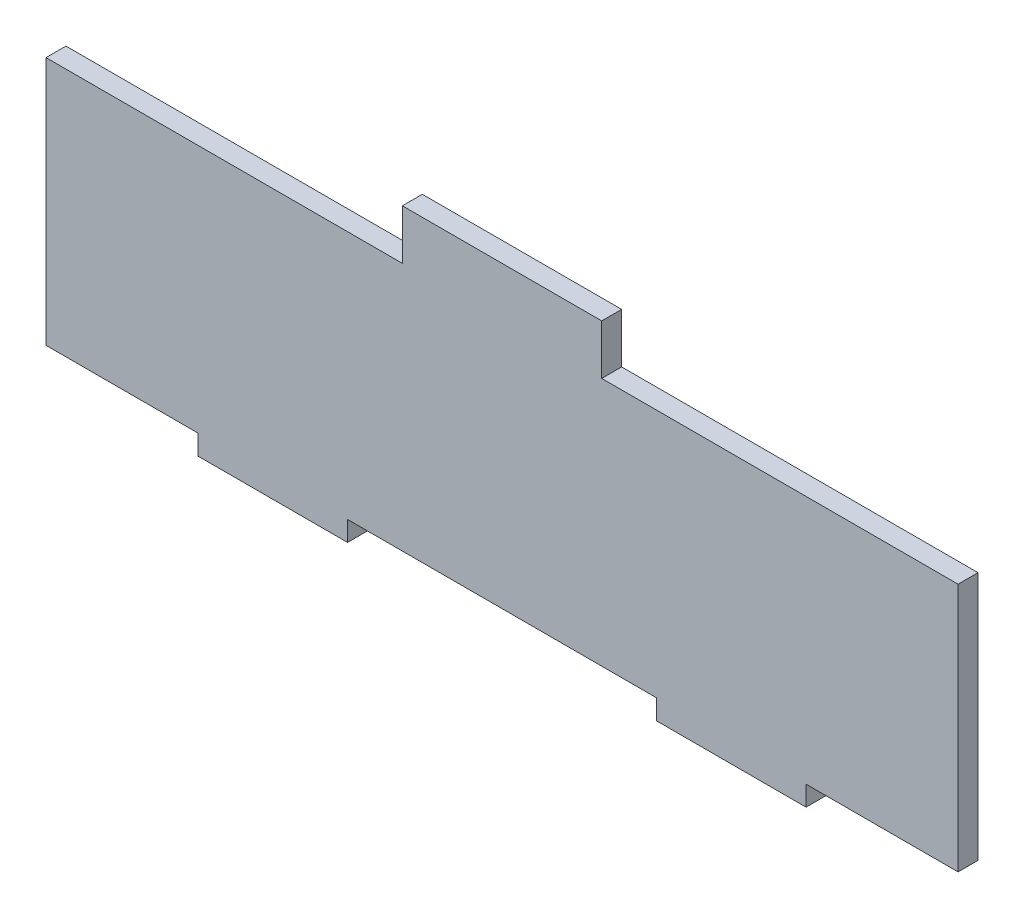
ISO-10303-21;
HEADER;
FILE_DESCRIPTION(('STEP AP214'),'2;1');
FILE_NAME('part.step','',(''),(''),'','','');
FILE_SCHEMA(('AUTOMOTIVE_DESIGN { 1 0 10303 214 1 1 1 1 }'));
ENDSEC;
DATA;
#1=APPLICATION_CONTEXT('core data for automotive mechanical design processes');
#2=APPLICATION_PROTOCOL_DEFINITION('international standard','automotive_design',2000,#1);
#3=PRODUCT_CONTEXT('',#1,'mechanical');
#4=PRODUCT('Part','Part','',(#3));
#5=PRODUCT_RELATED_PRODUCT_CATEGORY('part','',(#4));
#6=PRODUCT_DEFINITION_FORMATION('','',#4);
#7=PRODUCT_DEFINITION_CONTEXT('part definition',#1,'design');
#8=PRODUCT_DEFINITION('design','',#6,#7);
#9=PRODUCT_DEFINITION_SHAPE('','',#8);
#10=(LENGTH_UNIT() NAMED_UNIT(*) SI_UNIT(.MILLI.,.METRE.));
#11=(NAMED_UNIT(*) PLANE_ANGLE_UNIT() SI_UNIT($,.RADIAN.));
#12=(NAMED_UNIT(*) SI_UNIT($,.STERADIAN.) SOLID_ANGLE_UNIT());
#13=UNCERTAINTY_MEASURE_WITH_UNIT(LENGTH_MEASURE(1.E-05),#10,'distance_accuracy_value','');
#14=(GEOMETRIC_REPRESENTATION_CONTEXT(3) GLOBAL_UNCERTAINTY_ASSIGNED_CONTEXT((#13)) GLOBAL_UNIT_ASSIGNED_CONTEXT((#10,
#11,#12)) REPRESENTATION_CONTEXT('',''));
#15=CARTESIAN_POINT('',(0.,0.,0.));
#16=DIRECTION('',(0.,0.,1.));
#17=DIRECTION('',(1.,0.,0.));
#18=AXIS2_PLACEMENT_3D('',#15,#16,#17);
#19=CARTESIAN_POINT('',(20.,25.,4.));
#20=DIRECTION('',(0.,-1.,0.));
#21=DIRECTION('',(0.,0.,-1.));
#22=AXIS2_PLACEMENT_3D('',#19,#20,#21);
#23=PLANE('',#22);
#24=DIRECTION('',(-1.,0.,0.));
#25=VECTOR('',#24,1.);
#26=CARTESIAN_POINT('',(20.,25.,0.));
#27=LINE('',#26,#25);
#28=CARTESIAN_POINT('',(91.5,25.,0.));
#29=VERTEX_POINT('',#28);
#30=CARTESIAN_POINT('',(20.,25.,0.));
#31=VERTEX_POINT('',#30);
#32=EDGE_CURVE('E181',#29,#31,#27,.T.);
#33=ORIENTED_EDGE('',*,*,#32,.T.);
#34=DIRECTION('',(0.,0.,-1.));
#35=VECTOR('',#34,1.);
#36=CARTESIAN_POINT('',(20.,25.,4.));
#37=LINE('',#36,#35);
#38=CARTESIAN_POINT('',(20.,25.,4.));
#39=VERTEX_POINT('',#38);
#40=EDGE_CURVE('E11',#39,#31,#37,.T.);
#41=ORIENTED_EDGE('',*,*,#40,.F.);
#42=DIRECTION('',(-1.,0.,0.));
#43=VECTOR('',#42,1.);
#44=CARTESIAN_POINT('',(20.,25.,4.));
#45=LINE('',#44,#43);
#46=CARTESIAN_POINT('',(91.5,25.,4.));
#47=VERTEX_POINT('',#46);
#48=EDGE_CURVE('E213',#47,#39,#45,.T.);
#49=ORIENTED_EDGE('',*,*,#48,.F.);
#50=DIRECTION('',(0.,0.,-1.));
#51=VECTOR('',#50,1.);
#52=CARTESIAN_POINT('',(91.5,25.,4.));
#53=LINE('',#52,#51);
#54=EDGE_CURVE('E179',#47,#29,#53,.T.);
#55=ORIENTED_EDGE('',*,*,#54,.T.);
#56=EDGE_LOOP('',(#33,#41,#49,#55));
#57=FACE_BOUND('',#56,.T.);
#58=ADVANCED_FACE('F39',(#57),#23,.F.);
#59=CARTESIAN_POINT('',(20.,35.,4.));
#60=DIRECTION('',(-1.,0.,0.));
#61=DIRECTION('',(0.,0.,1.));
#62=AXIS2_PLACEMENT_3D('',#59,#60,#61);
#63=PLANE('',#62);
#64=DIRECTION('',(0.,1.,0.));
#65=VECTOR('',#64,1.);
#66=CARTESIAN_POINT('',(20.,35.,0.));
#67=LINE('',#66,#65);
#68=CARTESIAN_POINT('',(20.,35.,0.));
#69=VERTEX_POINT('',#68);
#70=EDGE_CURVE('E189',#31,#69,#67,.T.);
#71=ORIENTED_EDGE('',*,*,#70,.T.);
#72=DIRECTION('',(0.,0.,-1.));
#73=VECTOR('',#72,1.);
#74=CARTESIAN_POINT('',(20.,35.,4.));
#75=LINE('',#74,#73);
#76=CARTESIAN_POINT('',(20.,35.,4.));
#77=VERTEX_POINT('',#76);
#78=EDGE_CURVE('E50',#77,#69,#75,.T.);
#79=ORIENTED_EDGE('',*,*,#78,.F.);
#80=DIRECTION('',(0.,1.,0.));
#81=VECTOR('',#80,1.);
#82=CARTESIAN_POINT('',(20.,35.,4.));
#83=LINE('',#82,#81);
#84=EDGE_CURVE('E125',#39,#77,#83,.T.);
#85=ORIENTED_EDGE('',*,*,#84,.F.);
#86=ORIENTED_EDGE('',*,*,#40,.T.);
#87=EDGE_LOOP('',(#71,#79,#85,#86));
#88=FACE_BOUND('',#87,.T.);
#89=ADVANCED_FACE('F313',(#88),#63,.F.);
#90=CARTESIAN_POINT('',(-20.,35.,4.));
#91=DIRECTION('',(0.,-1.,0.));
#92=DIRECTION('',(0.,0.,-1.));
#93=AXIS2_PLACEMENT_3D('',#90,#91,#92);
#94=PLANE('',#93);
#95=DIRECTION('',(-1.,0.,0.));
#96=VECTOR('',#95,1.);
#97=CARTESIAN_POINT('',(-20.,35.,0.));
#98=LINE('',#97,#96);
#99=CARTESIAN_POINT('',(-20.,35.,0.));
#100=VERTEX_POINT('',#99);
#101=EDGE_CURVE('E190',#69,#100,#98,.T.);
#102=ORIENTED_EDGE('',*,*,#101,.T.);
#103=DIRECTION('',(0.,0.,-1.));
#104=VECTOR('',#103,1.);
#105=CARTESIAN_POINT('',(-20.,35.,4.));
#106=LINE('',#105,#104);
#107=CARTESIAN_POINT('',(-20.,35.,4.));
#108=VERTEX_POINT('',#107);
#109=EDGE_CURVE('E243',#108,#100,#106,.T.);
#110=ORIENTED_EDGE('',*,*,#109,.F.);
#111=DIRECTION('',(-1.,0.,0.));
#112=VECTOR('',#111,1.);
#113=CARTESIAN_POINT('',(-20.,35.,4.));
#114=LINE('',#113,#112);
#115=EDGE_CURVE('E252',#77,#108,#114,.T.);
#116=ORIENTED_EDGE('',*,*,#115,.F.);
#117=ORIENTED_EDGE('',*,*,#78,.T.);
#118=EDGE_LOOP('',(#102,#110,#116,#117));
#119=FACE_BOUND('',#118,.T.);
#120=ADVANCED_FACE('F247',(#119),#94,.F.);
#121=CARTESIAN_POINT('',(-20.,25.,4.));
#122=DIRECTION('',(1.,0.,0.));
#123=DIRECTION('',(0.,0.,-1.));
#124=AXIS2_PLACEMENT_3D('',#121,#122,#123);
#125=PLANE('',#124);
#126=DIRECTION('',(0.,-1.,0.));
#127=VECTOR('',#126,1.);
#128=CARTESIAN_POINT('',(-20.,25.,0.));
#129=LINE('',#128,#127);
#130=CARTESIAN_POINT('',(-20.,25.,0.));
#131=VERTEX_POINT('',#130);
#132=EDGE_CURVE('E187',#100,#131,#129,.T.);
#133=ORIENTED_EDGE('',*,*,#132,.T.);
#134=DIRECTION('',(0.,0.,-1.));
#135=VECTOR('',#134,1.);
#136=CARTESIAN_POINT('',(-20.,25.,4.));
#137=LINE('',#136,#135);
#138=CARTESIAN_POINT('',(-20.,25.,4.));
#139=VERTEX_POINT('',#138);
#140=EDGE_CURVE('E244',#139,#131,#137,.T.);
#141=ORIENTED_EDGE('',*,*,#140,.F.);
#142=DIRECTION('',(0.,-1.,0.));
#143=VECTOR('',#142,1.);
#144=CARTESIAN_POINT('',(-20.,25.,4.));
#145=LINE('',#144,#143);
#146=EDGE_CURVE('E269',#108,#139,#145,.T.);
#147=ORIENTED_EDGE('',*,*,#146,.F.);
#148=ORIENTED_EDGE('',*,*,#109,.T.);
#149=EDGE_LOOP('',(#133,#141,#147,#148));
#150=FACE_BOUND('',#149,.T.);
#151=ADVANCED_FACE('F261',(#150),#125,.F.);
#152=CARTESIAN_POINT('',(-91.5,25.,4.));
#153=DIRECTION('',(0.,-1.,0.));
#154=DIRECTION('',(0.,0.,-1.));
#155=AXIS2_PLACEMENT_3D('',#152,#153,#154);
#156=PLANE('',#155);
#157=DIRECTION('',(-1.,0.,0.));
#158=VECTOR('',#157,1.);
#159=CARTESIAN_POINT('',(-91.5,25.,0.));
#160=LINE('',#159,#158);
#161=CARTESIAN_POINT('',(-91.5,25.,0.));
#162=VERTEX_POINT('',#161);
#163=EDGE_CURVE('E195',#131,#162,#160,.T.);
#164=ORIENTED_EDGE('',*,*,#163,.T.);
#165=DIRECTION('',(0.,0.,-1.));
#166=VECTOR('',#165,1.);
#167=CARTESIAN_POINT('',(-91.5,25.,4.));
#168=LINE('',#167,#166);
#169=CARTESIAN_POINT('',(-91.5,25.,4.));
#170=VERTEX_POINT('',#169);
#171=EDGE_CURVE('E236',#170,#162,#168,.T.);
#172=ORIENTED_EDGE('',*,*,#171,.F.);
#173=DIRECTION('',(-1.,0.,0.));
#174=VECTOR('',#173,1.);
#175=CARTESIAN_POINT('',(-91.5,25.,4.));
#176=LINE('',#175,#174);
#177=EDGE_CURVE('E270',#139,#170,#176,.T.);
#178=ORIENTED_EDGE('',*,*,#177,.F.);
#179=ORIENTED_EDGE('',*,*,#140,.T.);
#180=EDGE_LOOP('',(#164,#172,#178,#179));
#181=FACE_BOUND('',#180,.T.);
#182=ADVANCED_FACE('F264',(#181),#156,.F.);
#183=CARTESIAN_POINT('',(-91.5,-25.,4.));
#184=DIRECTION('',(1.,0.,0.));
#185=DIRECTION('',(0.,0.,-1.));
#186=AXIS2_PLACEMENT_3D('',#183,#184,#185);
#187=PLANE('',#186);
#188=DIRECTION('',(0.,-1.,0.));
#189=VECTOR('',#188,1.);
#190=CARTESIAN_POINT('',(-91.5,-25.,0.));
#191=LINE('',#190,#189);
#192=CARTESIAN_POINT('',(-91.5,-25.,0.));
#193=VERTEX_POINT('',#192);
#194=EDGE_CURVE('E194',#162,#193,#191,.T.);
#195=ORIENTED_EDGE('',*,*,#194,.T.);
#196=DIRECTION('',(0.,0.,-1.));
#197=VECTOR('',#196,1.);
#198=CARTESIAN_POINT('',(-91.5,-25.,4.));
#199=LINE('',#198,#197);
#200=CARTESIAN_POINT('',(-91.5,-25.,4.));
#201=VERTEX_POINT('',#200);
#202=EDGE_CURVE('E232',#201,#193,#199,.T.);
#203=ORIENTED_EDGE('',*,*,#202,.F.);
#204=DIRECTION('',(0.,-1.,0.));
#205=VECTOR('',#204,1.);
#206=CARTESIAN_POINT('',(-91.5,-25.,4.));
#207=LINE('',#206,#205);
#208=EDGE_CURVE('E267',#170,#201,#207,.T.);
#209=ORIENTED_EDGE('',*,*,#208,.F.);
#210=ORIENTED_EDGE('',*,*,#171,.T.);
#211=EDGE_LOOP('',(#195,#203,#209,#210));
#212=FACE_BOUND('',#211,.T.);
#213=ADVANCED_FACE('F322',(#212),#187,.F.);
#214=CARTESIAN_POINT('',(-91.5,-25.,4.));
#215=DIRECTION('',(0.,1.,0.));
#216=DIRECTION('',(-1.,0.,0.));
#217=AXIS2_PLACEMENT_3D('',#214,#215,#216);
#218=PLANE('',#217);
#219=DIRECTION('',(1.,0.,0.));
#220=VECTOR('',#219,1.);
#221=CARTESIAN_POINT('',(-91.5,-25.,0.));
#222=LINE('',#221,#220);
#223=CARTESIAN_POINT('',(-61.,-25.,0.));
#224=VERTEX_POINT('',#223);
#225=EDGE_CURVE('E198',#193,#224,#222,.T.);
#226=ORIENTED_EDGE('',*,*,#225,.T.);
#227=DIRECTION('',(0.,0.,-1.));
#228=VECTOR('',#227,1.);
#229=CARTESIAN_POINT('',(-61.,-25.,4.));
#230=LINE('',#229,#228);
#231=CARTESIAN_POINT('',(-61.,-25.,4.));
#232=VERTEX_POINT('',#231);
#233=EDGE_CURVE('E235',#232,#224,#230,.T.);
#234=ORIENTED_EDGE('',*,*,#233,.F.);
#235=DIRECTION('',(1.,0.,0.));
#236=VECTOR('',#235,1.);
#237=CARTESIAN_POINT('',(-91.5,-25.,4.));
#238=LINE('',#237,#236);
#239=EDGE_CURVE('E275',#201,#232,#238,.T.);
#240=ORIENTED_EDGE('',*,*,#239,.F.);
#241=ORIENTED_EDGE('',*,*,#202,.T.);
#242=EDGE_LOOP('',(#226,#234,#240,#241));
#243=FACE_BOUND('',#242,.T.);
#244=ADVANCED_FACE('F330',(#243),#218,.F.);
#245=CARTESIAN_POINT('',(-61.,-25.,4.));
#246=DIRECTION('',(1.,0.,0.));
#247=DIRECTION('',(0.,1.,0.));
#248=AXIS2_PLACEMENT_3D('',#245,#246,#247);
#249=PLANE('',#248);
#250=DIRECTION('',(0.,-1.,0.));
#251=VECTOR('',#250,1.);
#252=CARTESIAN_POINT('',(-61.,-25.,0.));
#253=LINE('',#252,#251);
#254=CARTESIAN_POINT('',(-61.,-29.,0.));
#255=VERTEX_POINT('',#254);
#256=EDGE_CURVE('E196',#224,#255,#253,.T.);
#257=ORIENTED_EDGE('',*,*,#256,.T.);
#258=DIRECTION('',(0.,0.,-1.));
#259=VECTOR('',#258,1.);
#260=CARTESIAN_POINT('',(-61.,-29.,4.));
#261=LINE('',#260,#259);
#262=CARTESIAN_POINT('',(-61.,-29.,4.));
#263=VERTEX_POINT('',#262);
#264=EDGE_CURVE('E228',#263,#255,#261,.T.);
#265=ORIENTED_EDGE('',*,*,#264,.F.);
#266=DIRECTION('',(0.,-1.,0.));
#267=VECTOR('',#266,1.);
#268=CARTESIAN_POINT('',(-61.,-25.,4.));
#269=LINE('',#268,#267);
#270=EDGE_CURVE('E279',#232,#263,#269,.T.);
#271=ORIENTED_EDGE('',*,*,#270,.F.);
#272=ORIENTED_EDGE('',*,*,#233,.T.);
#273=EDGE_LOOP('',(#257,#265,#271,#272));
#274=FACE_BOUND('',#273,.T.);
#275=ADVANCED_FACE('F332',(#274),#249,.F.);
#276=CARTESIAN_POINT('',(-61.,-29.,4.));
#277=DIRECTION('',(0.,1.,0.));
#278=DIRECTION('',(0.,0.,1.));
#279=AXIS2_PLACEMENT_3D('',#276,#277,#278);
#280=PLANE('',#279);
#281=DIRECTION('',(1.,0.,0.));
#282=VECTOR('',#281,1.);
#283=CARTESIAN_POINT('',(-61.,-29.,0.));
#284=LINE('',#283,#282);
#285=CARTESIAN_POINT('',(-31.,-29.,0.));
#286=VERTEX_POINT('',#285);
#287=EDGE_CURVE('E199',#255,#286,#284,.T.);
#288=ORIENTED_EDGE('',*,*,#287,.T.);
#289=DIRECTION('',(0.,0.,-1.));
#290=VECTOR('',#289,1.);
#291=CARTESIAN_POINT('',(-31.,-29.,4.));
#292=LINE('',#291,#290);
#293=CARTESIAN_POINT('',(-31.,-29.,4.));
#294=VERTEX_POINT('',#293);
#295=EDGE_CURVE('E229',#294,#286,#292,.T.);
#296=ORIENTED_EDGE('',*,*,#295,.F.);
#297=DIRECTION('',(1.,0.,0.));
#298=VECTOR('',#297,1.);
#299=CARTESIAN_POINT('',(-61.,-29.,4.));
#300=LINE('',#299,#298);
#301=EDGE_CURVE('E278',#263,#294,#300,.T.);
#302=ORIENTED_EDGE('',*,*,#301,.F.);
#303=ORIENTED_EDGE('',*,*,#264,.T.);
#304=EDGE_LOOP('',(#288,#296,#302,#303));
#305=FACE_BOUND('',#304,.T.);
#306=ADVANCED_FACE('F333',(#305),#280,.F.);
#307=CARTESIAN_POINT('',(-31.,-29.,4.));
#308=DIRECTION('',(-1.,0.,0.));
#309=DIRECTION('',(0.,-1.,0.));
#310=AXIS2_PLACEMENT_3D('',#307,#308,#309);
#311=PLANE('',#310);
#312=DIRECTION('',(0.,1.,0.));
#313=VECTOR('',#312,1.);
#314=CARTESIAN_POINT('',(-31.,-29.,0.));
#315=LINE('',#314,#313);
#316=CARTESIAN_POINT('',(-31.,-25.,0.));
#317=VERTEX_POINT('',#316);
#318=EDGE_CURVE('E205',#286,#317,#315,.T.);
#319=ORIENTED_EDGE('',*,*,#318,.T.);
#320=DIRECTION('',(0.,0.,-1.));
#321=VECTOR('',#320,1.);
#322=CARTESIAN_POINT('',(-31.,-25.,4.));
#323=LINE('',#322,#321);
#324=CARTESIAN_POINT('',(-31.,-25.,4.));
#325=VERTEX_POINT('',#324);
#326=EDGE_CURVE('E224',#325,#317,#323,.T.);
#327=ORIENTED_EDGE('',*,*,#326,.F.);
#328=DIRECTION('',(0.,1.,0.));
#329=VECTOR('',#328,1.);
#330=CARTESIAN_POINT('',(-31.,-29.,4.));
#331=LINE('',#330,#329);
#332=EDGE_CURVE('E281',#294,#325,#331,.T.);
#333=ORIENTED_EDGE('',*,*,#332,.F.);
#334=ORIENTED_EDGE('',*,*,#295,.T.);
#335=EDGE_LOOP('',(#319,#327,#333,#334));
#336=FACE_BOUND('',#335,.T.);
#337=ADVANCED_FACE('F338',(#336),#311,.F.);
#338=CARTESIAN_POINT('',(-31.,-25.,4.));
#339=DIRECTION('',(0.,1.,0.));
#340=DIRECTION('',(0.,0.,1.));
#341=AXIS2_PLACEMENT_3D('',#338,#339,#340);
#342=PLANE('',#341);
#343=DIRECTION('',(1.,0.,0.));
#344=VECTOR('',#343,1.);
#345=CARTESIAN_POINT('',(-31.,-25.,0.));
#346=LINE('',#345,#344);
#347=CARTESIAN_POINT('',(31.,-25.,0.));
#348=VERTEX_POINT('',#347);
#349=EDGE_CURVE('E204',#317,#348,#346,.T.);
#350=ORIENTED_EDGE('',*,*,#349,.T.);
#351=DIRECTION('',(0.,0.,-1.));
#352=VECTOR('',#351,1.);
#353=CARTESIAN_POINT('',(31.,-25.,4.));
#354=LINE('',#353,#352);
#355=CARTESIAN_POINT('',(31.,-25.,4.));
#356=VERTEX_POINT('',#355);
#357=EDGE_CURVE('E219',#356,#348,#354,.T.);
#358=ORIENTED_EDGE('',*,*,#357,.F.);
#359=DIRECTION('',(1.,0.,0.));
#360=VECTOR('',#359,1.);
#361=CARTESIAN_POINT('',(-31.,-25.,4.));
#362=LINE('',#361,#360);
#363=EDGE_CURVE('E283',#325,#356,#362,.T.);
#364=ORIENTED_EDGE('',*,*,#363,.F.);
#365=ORIENTED_EDGE('',*,*,#326,.T.);
#366=EDGE_LOOP('',(#350,#358,#364,#365));
#367=FACE_BOUND('',#366,.T.);
#368=ADVANCED_FACE('F341',(#367),#342,.F.);
#369=CARTESIAN_POINT('',(31.,-25.,4.));
#370=DIRECTION('',(1.,0.,0.));
#371=DIRECTION('',(0.,0.,-1.));
#372=AXIS2_PLACEMENT_3D('',#369,#370,#371);
#373=PLANE('',#372);
#374=DIRECTION('',(0.,-1.,0.));
#375=VECTOR('',#374,1.);
#376=CARTESIAN_POINT('',(31.,-25.,0.));
#377=LINE('',#376,#375);
#378=CARTESIAN_POINT('',(31.,-29.,0.));
#379=VERTEX_POINT('',#378);
#380=EDGE_CURVE('E206',#348,#379,#377,.T.);
#381=ORIENTED_EDGE('',*,*,#380,.T.);
#382=DIRECTION('',(0.,0.,-1.));
#383=VECTOR('',#382,1.);
#384=CARTESIAN_POINT('',(31.,-29.,4.));
#385=LINE('',#384,#383);
#386=CARTESIAN_POINT('',(31.,-29.,4.));
#387=VERTEX_POINT('',#386);
#388=EDGE_CURVE('E220',#387,#379,#385,.T.);
#389=ORIENTED_EDGE('',*,*,#388,.F.);
#390=DIRECTION('',(0.,-1.,0.));
#391=VECTOR('',#390,1.);
#392=CARTESIAN_POINT('',(31.,-25.,4.));
#393=LINE('',#392,#391);
#394=EDGE_CURVE('E288',#356,#387,#393,.T.);
#395=ORIENTED_EDGE('',*,*,#394,.F.);
#396=ORIENTED_EDGE('',*,*,#357,.T.);
#397=EDGE_LOOP('',(#381,#389,#395,#396));
#398=FACE_BOUND('',#397,.T.);
#399=ADVANCED_FACE('F295',(#398),#373,.F.);
#400=CARTESIAN_POINT('',(31.,-29.,4.));
#401=DIRECTION('',(0.,1.,0.));
#402=DIRECTION('',(0.,0.,1.));
#403=AXIS2_PLACEMENT_3D('',#400,#401,#402);
#404=PLANE('',#403);
#405=DIRECTION('',(1.,0.,0.));
#406=VECTOR('',#405,1.);
#407=CARTESIAN_POINT('',(31.,-29.,0.));
#408=LINE('',#407,#406);
#409=CARTESIAN_POINT('',(61.,-29.,0.));
#410=VERTEX_POINT('',#409);
#411=EDGE_CURVE('E208',#379,#410,#408,.T.);
#412=ORIENTED_EDGE('',*,*,#411,.T.);
#413=DIRECTION('',(0.,0.,-1.));
#414=VECTOR('',#413,1.);
#415=CARTESIAN_POINT('',(61.,-29.,4.));
#416=LINE('',#415,#414);
#417=CARTESIAN_POINT('',(61.,-29.,4.));
#418=VERTEX_POINT('',#417);
#419=EDGE_CURVE('E173',#418,#410,#416,.T.);
#420=ORIENTED_EDGE('',*,*,#419,.F.);
#421=DIRECTION('',(1.,0.,0.));
#422=VECTOR('',#421,1.);
#423=CARTESIAN_POINT('',(31.,-29.,4.));
#424=LINE('',#423,#422);
#425=EDGE_CURVE('E164',#387,#418,#424,.T.);
#426=ORIENTED_EDGE('',*,*,#425,.F.);
#427=ORIENTED_EDGE('',*,*,#388,.T.);
#428=EDGE_LOOP('',(#412,#420,#426,#427));
#429=FACE_BOUND('',#428,.T.);
#430=ADVANCED_FACE('F299',(#429),#404,.F.);
#431=CARTESIAN_POINT('',(61.,-29.,4.));
#432=DIRECTION('',(-1.,0.,0.));
#433=DIRECTION('',(0.,0.,1.));
#434=AXIS2_PLACEMENT_3D('',#431,#432,#433);
#435=PLANE('',#434);
#436=DIRECTION('',(0.,1.,0.));
#437=VECTOR('',#436,1.);
#438=CARTESIAN_POINT('',(61.,-29.,0.));
#439=LINE('',#438,#437);
#440=CARTESIAN_POINT('',(61.,-25.,0.));
#441=VERTEX_POINT('',#440);
#442=EDGE_CURVE('E175',#410,#441,#439,.T.);
#443=ORIENTED_EDGE('',*,*,#442,.T.);
#444=DIRECTION('',(0.,0.,-1.));
#445=VECTOR('',#444,1.);
#446=CARTESIAN_POINT('',(61.,-25.,4.));
#447=LINE('',#446,#445);
#448=CARTESIAN_POINT('',(61.,-25.,4.));
#449=VERTEX_POINT('',#448);
#450=EDGE_CURVE('E168',#449,#441,#447,.T.);
#451=ORIENTED_EDGE('',*,*,#450,.F.);
#452=DIRECTION('',(0.,1.,0.));
#453=VECTOR('',#452,1.);
#454=CARTESIAN_POINT('',(61.,-29.,4.));
#455=LINE('',#454,#453);
#456=EDGE_CURVE('E157',#418,#449,#455,.T.);
#457=ORIENTED_EDGE('',*,*,#456,.F.);
#458=ORIENTED_EDGE('',*,*,#419,.T.);
#459=EDGE_LOOP('',(#443,#451,#457,#458));
#460=FACE_BOUND('',#459,.T.);
#461=ADVANCED_FACE('F174',(#460),#435,.F.);
#462=CARTESIAN_POINT('',(61.,-25.,4.));
#463=DIRECTION('',(0.,1.,0.));
#464=DIRECTION('',(-1.,0.,0.));
#465=AXIS2_PLACEMENT_3D('',#462,#463,#464);
#466=PLANE('',#465);
#467=DIRECTION('',(1.,0.,0.));
#468=VECTOR('',#467,1.);
#469=CARTESIAN_POINT('',(61.,-25.,0.));
#470=LINE('',#469,#468);
#471=CARTESIAN_POINT('',(91.5,-25.,0.));
#472=VERTEX_POINT('',#471);
#473=EDGE_CURVE('E107',#441,#472,#470,.T.);
#474=ORIENTED_EDGE('',*,*,#473,.T.);
#475=DIRECTION('',(0.,0.,-1.));
#476=VECTOR('',#475,1.);
#477=CARTESIAN_POINT('',(91.5,-25.,4.));
#478=LINE('',#477,#476);
#479=CARTESIAN_POINT('',(91.5,-25.,4.));
#480=VERTEX_POINT('',#479);
#481=EDGE_CURVE('E172',#480,#472,#478,.T.);
#482=ORIENTED_EDGE('',*,*,#481,.F.);
#483=DIRECTION('',(1.,0.,0.));
#484=VECTOR('',#483,1.);
#485=CARTESIAN_POINT('',(61.,-25.,4.));
#486=LINE('',#485,#484);
#487=EDGE_CURVE('E162',#449,#480,#486,.T.);
#488=ORIENTED_EDGE('',*,*,#487,.F.);
#489=ORIENTED_EDGE('',*,*,#450,.T.);
#490=EDGE_LOOP('',(#474,#482,#488,#489));
#491=FACE_BOUND('',#490,.T.);
#492=ADVANCED_FACE('F180',(#491),#466,.F.);
#493=CARTESIAN_POINT('',(91.5,-25.,4.));
#494=DIRECTION('',(-1.,0.,0.));
#495=DIRECTION('',(0.,0.,1.));
#496=AXIS2_PLACEMENT_3D('',#493,#494,#495);
#497=PLANE('',#496);
#498=DIRECTION('',(0.,1.,0.));
#499=VECTOR('',#498,1.);
#500=CARTESIAN_POINT('',(91.5,-25.,0.));
#501=LINE('',#500,#499);
#502=EDGE_CURVE('E111',#472,#29,#501,.T.);
#503=ORIENTED_EDGE('',*,*,#502,.T.);
#504=ORIENTED_EDGE('',*,*,#54,.F.);
#505=DIRECTION('',(0.,1.,0.));
#506=VECTOR('',#505,1.);
#507=CARTESIAN_POINT('',(91.5,-25.,4.));
#508=LINE('',#507,#506);
#509=EDGE_CURVE('E54',#480,#47,#508,.T.);
#510=ORIENTED_EDGE('',*,*,#509,.F.);
#511=ORIENTED_EDGE('',*,*,#481,.T.);
#512=EDGE_LOOP('',(#503,#504,#510,#511));
#513=FACE_BOUND('',#512,.T.);
#514=ADVANCED_FACE('F297',(#513),#497,.F.);
#515=CARTESIAN_POINT('',(0.,0.,4.));
#516=DIRECTION('',(0.,0.,1.));
#517=DIRECTION('',(1.,0.,0.));
#518=AXIS2_PLACEMENT_3D('',#515,#516,#517);
#519=PLANE('',#518);
#520=ORIENTED_EDGE('',*,*,#48,.T.);
#521=ORIENTED_EDGE('',*,*,#84,.T.);
#522=ORIENTED_EDGE('',*,*,#115,.T.);
#523=ORIENTED_EDGE('',*,*,#146,.T.);
#524=ORIENTED_EDGE('',*,*,#177,.T.);
#525=ORIENTED_EDGE('',*,*,#208,.T.);
#526=ORIENTED_EDGE('',*,*,#239,.T.);
#527=ORIENTED_EDGE('',*,*,#270,.T.);
#528=ORIENTED_EDGE('',*,*,#301,.T.);
#529=ORIENTED_EDGE('',*,*,#332,.T.);
#530=ORIENTED_EDGE('',*,*,#363,.T.);
#531=ORIENTED_EDGE('',*,*,#394,.T.);
#532=ORIENTED_EDGE('',*,*,#425,.T.);
#533=ORIENTED_EDGE('',*,*,#456,.T.);
#534=ORIENTED_EDGE('',*,*,#487,.T.);
#535=ORIENTED_EDGE('',*,*,#509,.T.);
#536=EDGE_LOOP('',(#520,#521,#522,#523,#524,#525,#526,#527,#528,#529,#530,#531,#532,#533,#534,#535));
#537=FACE_BOUND('',#536,.T.);
#538=ADVANCED_FACE('F161',(#537),#519,.T.);
#539=CARTESIAN_POINT('',(0.,0.,0.));
#540=DIRECTION('',(0.,0.,1.));
#541=DIRECTION('',(1.,0.,0.));
#542=AXIS2_PLACEMENT_3D('',#539,#540,#541);
#543=PLANE('',#542);
#544=ORIENTED_EDGE('',*,*,#32,.F.);
#545=ORIENTED_EDGE('',*,*,#502,.F.);
#546=ORIENTED_EDGE('',*,*,#473,.F.);
#547=ORIENTED_EDGE('',*,*,#442,.F.);
#548=ORIENTED_EDGE('',*,*,#411,.F.);
#549=ORIENTED_EDGE('',*,*,#380,.F.);
#550=ORIENTED_EDGE('',*,*,#349,.F.);
#551=ORIENTED_EDGE('',*,*,#318,.F.);
#552=ORIENTED_EDGE('',*,*,#287,.F.);
#553=ORIENTED_EDGE('',*,*,#256,.F.);
#554=ORIENTED_EDGE('',*,*,#225,.F.);
#555=ORIENTED_EDGE('',*,*,#194,.F.);
#556=ORIENTED_EDGE('',*,*,#163,.F.);
#557=ORIENTED_EDGE('',*,*,#132,.F.);
#558=ORIENTED_EDGE('',*,*,#101,.F.);
#559=ORIENTED_EDGE('',*,*,#70,.F.);
#560=EDGE_LOOP('',(#544,#545,#546,#547,#548,#549,#550,#551,#552,#553,#554,#555,#556,#557,#558,#559));
#561=FACE_BOUND('',#560,.T.);
#562=ADVANCED_FACE('F258',(#561),#543,.F.);
#563=CLOSED_SHELL('',(#58,#89,#120,#151,#182,#213,#244,#275,#306,#337,#368,#399,#430,#461,#492,
#514,#538,#562));
#564=MANIFOLD_SOLID_BREP('B2',#563);
#565=ADVANCED_BREP_SHAPE_REPRESENTATION('',(#18,#564),#14);
#566=SHAPE_DEFINITION_REPRESENTATION(#9,#565);
ENDSEC;
END-ISO-10303-21;
